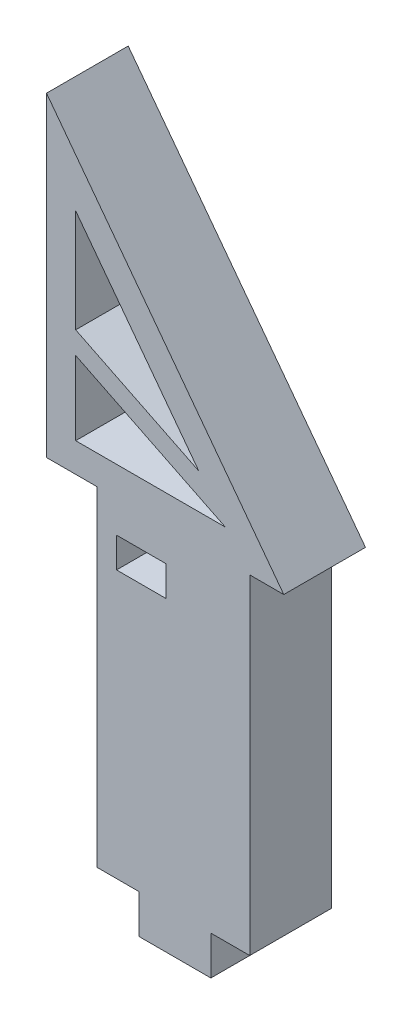
ISO-10303-21;
HEADER;
FILE_DESCRIPTION(('STEP AP214'),'2;1');
FILE_NAME('part.step','',(''),(''),'','','');
FILE_SCHEMA(('AUTOMOTIVE_DESIGN { 1 0 10303 214 1 1 1 1 }'));
ENDSEC;
DATA;
#1=APPLICATION_CONTEXT('core data for automotive mechanical design processes');
#2=APPLICATION_PROTOCOL_DEFINITION('international standard','automotive_design',2000,#1);
#3=PRODUCT_CONTEXT('',#1,'mechanical');
#4=PRODUCT('Part','Part','',(#3));
#5=PRODUCT_RELATED_PRODUCT_CATEGORY('part','',(#4));
#6=PRODUCT_DEFINITION_FORMATION('','',#4);
#7=PRODUCT_DEFINITION_CONTEXT('part definition',#1,'design');
#8=PRODUCT_DEFINITION('design','',#6,#7);
#9=PRODUCT_DEFINITION_SHAPE('','',#8);
#10=(LENGTH_UNIT() NAMED_UNIT(*) SI_UNIT(.MILLI.,.METRE.));
#11=(NAMED_UNIT(*) PLANE_ANGLE_UNIT() SI_UNIT($,.RADIAN.));
#12=(NAMED_UNIT(*) SI_UNIT($,.STERADIAN.) SOLID_ANGLE_UNIT());
#13=UNCERTAINTY_MEASURE_WITH_UNIT(LENGTH_MEASURE(1.E-05),#10,'distance_accuracy_value','');
#14=(GEOMETRIC_REPRESENTATION_CONTEXT(3) GLOBAL_UNCERTAINTY_ASSIGNED_CONTEXT((#13)) GLOBAL_UNIT_ASSIGNED_CONTEXT((#10,
#11,#12)) REPRESENTATION_CONTEXT('',''));
#15=CARTESIAN_POINT('',(0.,0.,0.));
#16=DIRECTION('',(0.,0.,1.));
#17=DIRECTION('',(1.,0.,0.));
#18=AXIS2_PLACEMENT_3D('',#15,#16,#17);
#19=CARTESIAN_POINT('',(-7.85,37.9,4.2));
#20=DIRECTION('',(1.,0.,0.));
#21=DIRECTION('',(0.,0.,-1.));
#22=AXIS2_PLACEMENT_3D('',#19,#20,#21);
#23=PLANE('',#22);
#24=DIRECTION('',(0.,-1.,0.));
#25=VECTOR('',#24,1.);
#26=CARTESIAN_POINT('',(-7.85,37.9,-4.2));
#27=LINE('',#26,#25);
#28=CARTESIAN_POINT('',(-7.85,37.9,-4.2));
#29=VERTEX_POINT('',#28);
#30=CARTESIAN_POINT('',(-7.85,4.,-4.2));
#31=VERTEX_POINT('',#30);
#32=EDGE_CURVE('E329',#29,#31,#27,.T.);
#33=ORIENTED_EDGE('',*,*,#32,.T.);
#34=DIRECTION('',(0.,0.,-1.));
#35=VECTOR('',#34,1.);
#36=CARTESIAN_POINT('',(-7.85,4.,4.2));
#37=LINE('',#36,#35);
#38=CARTESIAN_POINT('',(-7.85,4.,4.2));
#39=VERTEX_POINT('',#38);
#40=EDGE_CURVE('E218',#39,#31,#37,.T.);
#41=ORIENTED_EDGE('',*,*,#40,.F.);
#42=DIRECTION('',(0.,-1.,0.));
#43=VECTOR('',#42,1.);
#44=CARTESIAN_POINT('',(-7.85,37.9,4.2));
#45=LINE('',#44,#43);
#46=CARTESIAN_POINT('',(-7.85,37.9,4.2));
#47=VERTEX_POINT('',#46);
#48=EDGE_CURVE('E11',#47,#39,#45,.T.);
#49=ORIENTED_EDGE('',*,*,#48,.F.);
#50=DIRECTION('',(0.,0.,1.));
#51=VECTOR('',#50,1.);
#52=CARTESIAN_POINT('',(-7.85,37.9,4.2));
#53=LINE('',#52,#51);
#54=EDGE_CURVE('E322',#29,#47,#53,.T.);
#55=ORIENTED_EDGE('',*,*,#54,.F.);
#56=EDGE_LOOP('',(#33,#41,#49,#55));
#57=FACE_BOUND('',#56,.T.);
#58=ADVANCED_FACE('F32',(#57),#23,.F.);
#59=CARTESIAN_POINT('',(7.85,37.9,4.2));
#60=DIRECTION('',(0.,0.,-1.));
#61=DIRECTION('',(-1.,0.,0.));
#62=AXIS2_PLACEMENT_3D('',#59,#60,#61);
#63=PLANE('',#62);
#64=DIRECTION('',(-1.,0.,0.));
#65=VECTOR('',#64,1.);
#66=CARTESIAN_POINT('',(-0.749999999999998,31.49,4.2));
#67=LINE('',#66,#65);
#68=CARTESIAN_POINT('',(-0.749999999999998,31.49,4.2));
#69=VERTEX_POINT('',#68);
#70=CARTESIAN_POINT('',(-5.85,31.49,4.2));
#71=VERTEX_POINT('',#70);
#72=EDGE_CURVE('E182',#69,#71,#67,.T.);
#73=ORIENTED_EDGE('',*,*,#72,.T.);
#74=DIRECTION('',(0.,1.,0.));
#75=VECTOR('',#74,1.);
#76=CARTESIAN_POINT('',(-5.85,31.49,4.2));
#77=LINE('',#76,#75);
#78=CARTESIAN_POINT('',(-5.85,34.59,4.2));
#79=VERTEX_POINT('',#78);
#80=EDGE_CURVE('E176',#71,#79,#77,.T.);
#81=ORIENTED_EDGE('',*,*,#80,.T.);
#82=DIRECTION('',(1.,0.,0.));
#83=VECTOR('',#82,1.);
#84=CARTESIAN_POINT('',(-0.749999999999998,34.59,4.2));
#85=LINE('',#84,#83);
#86=CARTESIAN_POINT('',(-0.749999999999997,34.59,4.2));
#87=VERTEX_POINT('',#86);
#88=EDGE_CURVE('E185',#79,#87,#85,.T.);
#89=ORIENTED_EDGE('',*,*,#88,.T.);
#90=DIRECTION('',(0.,-1.,0.));
#91=VECTOR('',#90,1.);
#92=CARTESIAN_POINT('',(-0.749999999999998,31.49,4.2));
#93=LINE('',#92,#91);
#94=EDGE_CURVE('E46',#87,#69,#93,.T.);
#95=ORIENTED_EDGE('',*,*,#94,.T.);
#96=EDGE_LOOP('',(#73,#81,#89,#95));
#97=FACE_BOUND('',#96,.T.);
#98=DIRECTION('',(-1.,0.,0.));
#99=VECTOR('',#98,1.);
#100=CARTESIAN_POINT('',(5.34075216134061,40.9,4.2));
#101=LINE('',#100,#99);
#102=CARTESIAN_POINT('',(5.34075216134061,40.9,4.2));
#103=VERTEX_POINT('',#102);
#104=CARTESIAN_POINT('',(-10.05,40.9,4.2));
#105=VERTEX_POINT('',#104);
#106=EDGE_CURVE('E254',#103,#105,#101,.T.);
#107=ORIENTED_EDGE('',*,*,#106,.T.);
#108=DIRECTION('',(0.,1.,0.));
#109=VECTOR('',#108,1.);
#110=CARTESIAN_POINT('',(-10.05,40.9,4.2));
#111=LINE('',#110,#109);
#112=CARTESIAN_POINT('',(-10.05,48.4875437211514,4.2));
#113=VERTEX_POINT('',#112);
#114=EDGE_CURVE('E247',#105,#113,#111,.T.);
#115=ORIENTED_EDGE('',*,*,#114,.T.);
#116=DIRECTION('',(0.896926720508369,-0.44217921484179,0.));
#117=VECTOR('',#116,1.);
#118=CARTESIAN_POINT('',(-10.05,48.4875437211514,4.2));
#119=LINE('',#118,#117);
#120=EDGE_CURVE('E250',#113,#103,#119,.T.);
#121=ORIENTED_EDGE('',*,*,#120,.T.);
#122=EDGE_LOOP('',(#107,#115,#121));
#123=FACE_BOUND('',#122,.T.);
#124=DIRECTION('',(-0.896926720508369,0.44217921484179,0.));
#125=VECTOR('',#124,1.);
#126=CARTESIAN_POINT('',(2.61087112907547,44.5305180121723,4.2));
#127=LINE('',#126,#125);
#128=CARTESIAN_POINT('',(2.61087112907547,44.5305180121723,4.2));
#129=VERTEX_POINT('',#128);
#130=CARTESIAN_POINT('',(-10.05,50.772247606196,4.2));
#131=VERTEX_POINT('',#130);
#132=EDGE_CURVE('E278',#129,#131,#127,.T.);
#133=ORIENTED_EDGE('',*,*,#132,.T.);
#134=DIRECTION('',(0.,1.,0.));
#135=VECTOR('',#134,1.);
#136=CARTESIAN_POINT('',(-10.05,50.772247606196,4.2));
#137=LINE('',#136,#135);
#138=CARTESIAN_POINT('',(-10.05,61.3684388375206,4.2));
#139=VERTEX_POINT('',#138);
#140=EDGE_CURVE('E271',#131,#139,#137,.T.);
#141=ORIENTED_EDGE('',*,*,#140,.T.);
#142=DIRECTION('',(0.600984765930578,-0.799260477641281,0.));
#143=VECTOR('',#142,1.);
#144=CARTESIAN_POINT('',(-10.05,61.3684388375206,4.2));
#145=LINE('',#144,#143);
#146=EDGE_CURVE('E274',#139,#129,#145,.T.);
#147=ORIENTED_EDGE('',*,*,#146,.T.);
#148=EDGE_LOOP('',(#133,#141,#147));
#149=FACE_BOUND('',#148,.T.);
#150=DIRECTION('',(1.,0.,0.));
#151=VECTOR('',#150,1.);
#152=CARTESIAN_POINT('',(-3.55,4.,4.2));
#153=LINE('',#152,#151);
#154=CARTESIAN_POINT('',(-3.55,4.,4.2));
#155=VERTEX_POINT('',#154);
#156=EDGE_CURVE('E211',#39,#155,#153,.T.);
#157=ORIENTED_EDGE('',*,*,#156,.T.);
#158=DIRECTION('',(0.,-1.,0.));
#159=VECTOR('',#158,1.);
#160=CARTESIAN_POINT('',(-3.55,4.,4.2));
#161=LINE('',#160,#159);
#162=CARTESIAN_POINT('',(-3.55,0.,4.2));
#163=VERTEX_POINT('',#162);
#164=EDGE_CURVE('E214',#155,#163,#161,.T.);
#165=ORIENTED_EDGE('',*,*,#164,.T.);
#166=DIRECTION('',(1.,0.,0.));
#167=VECTOR('',#166,1.);
#168=CARTESIAN_POINT('',(7.85,0.,4.2));
#169=LINE('',#168,#167);
#170=CARTESIAN_POINT('',(3.85,0.,4.2));
#171=VERTEX_POINT('',#170);
#172=EDGE_CURVE('E317',#163,#171,#169,.T.);
#173=ORIENTED_EDGE('',*,*,#172,.T.);
#174=DIRECTION('',(0.,1.,0.));
#175=VECTOR('',#174,1.);
#176=CARTESIAN_POINT('',(3.85,4.,4.2));
#177=LINE('',#176,#175);
#178=CARTESIAN_POINT('',(3.85,4.,4.2));
#179=VERTEX_POINT('',#178);
#180=EDGE_CURVE('E231',#171,#179,#177,.T.);
#181=ORIENTED_EDGE('',*,*,#180,.T.);
#182=DIRECTION('',(1.,0.,0.));
#183=VECTOR('',#182,1.);
#184=CARTESIAN_POINT('',(3.85,4.,4.2));
#185=LINE('',#184,#183);
#186=CARTESIAN_POINT('',(7.85,4.,4.2));
#187=VERTEX_POINT('',#186);
#188=EDGE_CURVE('E234',#179,#187,#185,.T.);
#189=ORIENTED_EDGE('',*,*,#188,.T.);
#190=DIRECTION('',(0.,-1.,0.));
#191=VECTOR('',#190,1.);
#192=CARTESIAN_POINT('',(7.85,37.9,4.2));
#193=LINE('',#192,#191);
#194=CARTESIAN_POINT('',(7.85,37.9,4.2));
#195=VERTEX_POINT('',#194);
#196=EDGE_CURVE('E39',#195,#187,#193,.T.);
#197=ORIENTED_EDGE('',*,*,#196,.F.);
#198=DIRECTION('',(1.,0.,0.));
#199=VECTOR('',#198,1.);
#200=CARTESIAN_POINT('',(-13.05,37.9,4.2));
#201=LINE('',#200,#199);
#202=CARTESIAN_POINT('',(11.35,37.9,4.2));
#203=VERTEX_POINT('',#202);
#204=EDGE_CURVE('E309',#195,#203,#201,.T.);
#205=ORIENTED_EDGE('',*,*,#204,.T.);
#206=DIRECTION('',(-0.600984765930578,0.799260477641281,0.));
#207=VECTOR('',#206,1.);
#208=CARTESIAN_POINT('',(11.35,37.9,4.2));
#209=LINE('',#208,#207);
#210=CARTESIAN_POINT('',(-13.05,70.35,4.2));
#211=VERTEX_POINT('',#210);
#212=EDGE_CURVE('E299',#203,#211,#209,.T.);
#213=ORIENTED_EDGE('',*,*,#212,.T.);
#214=DIRECTION('',(0.,-1.,0.));
#215=VECTOR('',#214,1.);
#216=CARTESIAN_POINT('',(-13.05,70.35,4.2));
#217=LINE('',#216,#215);
#218=CARTESIAN_POINT('',(-13.05,37.9,4.2));
#219=VERTEX_POINT('',#218);
#220=EDGE_CURVE('E290',#211,#219,#217,.T.);
#221=ORIENTED_EDGE('',*,*,#220,.T.);
#222=EDGE_CURVE('E310',#219,#47,#201,.T.);
#223=ORIENTED_EDGE('',*,*,#222,.T.);
#224=ORIENTED_EDGE('',*,*,#48,.T.);
#225=EDGE_LOOP('',(#157,#165,#173,#181,#189,#197,#205,#213,#221,#223,#224));
#226=FACE_BOUND('',#225,.T.);
#227=ADVANCED_FACE('F189',(#97,#123,#149,#226),#63,.F.);
#228=CARTESIAN_POINT('',(7.85,37.9,4.2));
#229=DIRECTION('',(-1.,0.,0.));
#230=DIRECTION('',(0.,0.,1.));
#231=AXIS2_PLACEMENT_3D('',#228,#229,#230);
#232=PLANE('',#231);
#233=ORIENTED_EDGE('',*,*,#196,.T.);
#234=DIRECTION('',(0.,0.,-1.));
#235=VECTOR('',#234,1.);
#236=CARTESIAN_POINT('',(7.85,4.,4.2));
#237=LINE('',#236,#235);
#238=CARTESIAN_POINT('',(7.85,4.,-4.2));
#239=VERTEX_POINT('',#238);
#240=EDGE_CURVE('E222',#187,#239,#237,.T.);
#241=ORIENTED_EDGE('',*,*,#240,.T.);
#242=DIRECTION('',(0.,-1.,0.));
#243=VECTOR('',#242,1.);
#244=CARTESIAN_POINT('',(7.85,37.9,-4.2));
#245=LINE('',#244,#243);
#246=CARTESIAN_POINT('',(7.85,37.9,-4.2));
#247=VERTEX_POINT('',#246);
#248=EDGE_CURVE('E336',#247,#239,#245,.T.);
#249=ORIENTED_EDGE('',*,*,#248,.F.);
#250=DIRECTION('',(0.,0.,-1.));
#251=VECTOR('',#250,1.);
#252=CARTESIAN_POINT('',(7.85,37.9,4.2));
#253=LINE('',#252,#251);
#254=EDGE_CURVE('E325',#195,#247,#253,.T.);
#255=ORIENTED_EDGE('',*,*,#254,.F.);
#256=EDGE_LOOP('',(#233,#241,#249,#255));
#257=FACE_BOUND('',#256,.T.);
#258=ADVANCED_FACE('F341',(#257),#232,.F.);
#259=CARTESIAN_POINT('',(7.85,37.9,-4.2));
#260=DIRECTION('',(0.,0.,1.));
#261=DIRECTION('',(1.,0.,0.));
#262=AXIS2_PLACEMENT_3D('',#259,#260,#261);
#263=PLANE('',#262);
#264=DIRECTION('',(1.,0.,0.));
#265=VECTOR('',#264,1.);
#266=CARTESIAN_POINT('',(-0.749999999999998,34.59,-4.2));
#267=LINE('',#266,#265);
#268=CARTESIAN_POINT('',(-5.85,34.59,-4.2));
#269=VERTEX_POINT('',#268);
#270=CARTESIAN_POINT('',(-0.749999999999998,34.59,-4.2));
#271=VERTEX_POINT('',#270);
#272=EDGE_CURVE('E201',#269,#271,#267,.T.);
#273=ORIENTED_EDGE('',*,*,#272,.F.);
#274=DIRECTION('',(0.,1.,0.));
#275=VECTOR('',#274,1.);
#276=CARTESIAN_POINT('',(-5.85,31.49,-4.2));
#277=LINE('',#276,#275);
#278=CARTESIAN_POINT('',(-5.85,31.49,-4.2));
#279=VERTEX_POINT('',#278);
#280=EDGE_CURVE('E54',#279,#269,#277,.T.);
#281=ORIENTED_EDGE('',*,*,#280,.F.);
#282=DIRECTION('',(-1.,0.,0.));
#283=VECTOR('',#282,1.);
#284=CARTESIAN_POINT('',(-0.749999999999998,31.49,-4.2));
#285=LINE('',#284,#283);
#286=CARTESIAN_POINT('',(-0.749999999999998,31.49,-4.2));
#287=VERTEX_POINT('',#286);
#288=EDGE_CURVE('E192',#287,#279,#285,.T.);
#289=ORIENTED_EDGE('',*,*,#288,.F.);
#290=DIRECTION('',(0.,-1.,0.));
#291=VECTOR('',#290,1.);
#292=CARTESIAN_POINT('',(-0.749999999999998,31.49,-4.2));
#293=LINE('',#292,#291);
#294=EDGE_CURVE('E195',#271,#287,#293,.T.);
#295=ORIENTED_EDGE('',*,*,#294,.F.);
#296=EDGE_LOOP('',(#273,#281,#289,#295));
#297=FACE_BOUND('',#296,.T.);
#298=DIRECTION('',(0.896926720508369,-0.44217921484179,0.));
#299=VECTOR('',#298,1.);
#300=CARTESIAN_POINT('',(-10.05,48.4875437211514,-4.2));
#301=LINE('',#300,#299);
#302=CARTESIAN_POINT('',(-10.05,48.4875437211514,-4.2));
#303=VERTEX_POINT('',#302);
#304=CARTESIAN_POINT('',(5.34075216134061,40.9,-4.2));
#305=VERTEX_POINT('',#304);
#306=EDGE_CURVE('E259',#303,#305,#301,.T.);
#307=ORIENTED_EDGE('',*,*,#306,.F.);
#308=DIRECTION('',(0.,1.,0.));
#309=VECTOR('',#308,1.);
#310=CARTESIAN_POINT('',(-10.05,40.9,-4.2));
#311=LINE('',#310,#309);
#312=CARTESIAN_POINT('',(-10.05,40.9,-4.2));
#313=VERTEX_POINT('',#312);
#314=EDGE_CURVE('E227',#313,#303,#311,.T.);
#315=ORIENTED_EDGE('',*,*,#314,.F.);
#316=DIRECTION('',(-1.,0.,0.));
#317=VECTOR('',#316,1.);
#318=CARTESIAN_POINT('',(5.34075216134061,40.9,-4.2));
#319=LINE('',#318,#317);
#320=EDGE_CURVE('E251',#305,#313,#319,.T.);
#321=ORIENTED_EDGE('',*,*,#320,.F.);
#322=EDGE_LOOP('',(#307,#315,#321));
#323=FACE_BOUND('',#322,.T.);
#324=DIRECTION('',(0.600984765930578,-0.799260477641281,0.));
#325=VECTOR('',#324,1.);
#326=CARTESIAN_POINT('',(-10.05,61.3684388375206,-4.2));
#327=LINE('',#326,#325);
#328=CARTESIAN_POINT('',(-10.05,61.3684388375206,-4.2));
#329=VERTEX_POINT('',#328);
#330=CARTESIAN_POINT('',(2.61087112907547,44.5305180121723,-4.2));
#331=VERTEX_POINT('',#330);
#332=EDGE_CURVE('E283',#329,#331,#327,.T.);
#333=ORIENTED_EDGE('',*,*,#332,.F.);
#334=DIRECTION('',(0.,1.,0.));
#335=VECTOR('',#334,1.);
#336=CARTESIAN_POINT('',(-10.05,50.772247606196,-4.2));
#337=LINE('',#336,#335);
#338=CARTESIAN_POINT('',(-10.05,50.772247606196,-4.2));
#339=VERTEX_POINT('',#338);
#340=EDGE_CURVE('E266',#339,#329,#337,.T.);
#341=ORIENTED_EDGE('',*,*,#340,.F.);
#342=DIRECTION('',(-0.896926720508369,0.44217921484179,0.));
#343=VECTOR('',#342,1.);
#344=CARTESIAN_POINT('',(2.61087112907547,44.5305180121723,-4.2));
#345=LINE('',#344,#343);
#346=EDGE_CURVE('E275',#331,#339,#345,.T.);
#347=ORIENTED_EDGE('',*,*,#346,.F.);
#348=EDGE_LOOP('',(#333,#341,#347));
#349=FACE_BOUND('',#348,.T.);
#350=DIRECTION('',(-1.,0.,0.));
#351=VECTOR('',#350,1.);
#352=CARTESIAN_POINT('',(7.85,0.,-4.2));
#353=LINE('',#352,#351);
#354=CARTESIAN_POINT('',(3.85,0.,-4.2));
#355=VERTEX_POINT('',#354);
#356=CARTESIAN_POINT('',(-3.55,0.,-4.2));
#357=VERTEX_POINT('',#356);
#358=EDGE_CURVE('E326',#355,#357,#353,.T.);
#359=ORIENTED_EDGE('',*,*,#358,.T.);
#360=DIRECTION('',(0.,-1.,0.));
#361=VECTOR('',#360,1.);
#362=CARTESIAN_POINT('',(-3.55,4.,-4.2));
#363=LINE('',#362,#361);
#364=CARTESIAN_POINT('',(-3.55,4.,-4.2));
#365=VERTEX_POINT('',#364);
#366=EDGE_CURVE('E215',#365,#357,#363,.T.);
#367=ORIENTED_EDGE('',*,*,#366,.F.);
#368=DIRECTION('',(1.,0.,0.));
#369=VECTOR('',#368,1.);
#370=CARTESIAN_POINT('',(-3.55,4.,-4.2));
#371=LINE('',#370,#369);
#372=EDGE_CURVE('E219',#31,#365,#371,.T.);
#373=ORIENTED_EDGE('',*,*,#372,.F.);
#374=ORIENTED_EDGE('',*,*,#32,.F.);
#375=DIRECTION('',(1.,0.,0.));
#376=VECTOR('',#375,1.);
#377=CARTESIAN_POINT('',(-13.05,37.9,-4.2));
#378=LINE('',#377,#376);
#379=CARTESIAN_POINT('',(-13.05,37.9,-4.2));
#380=VERTEX_POINT('',#379);
#381=EDGE_CURVE('E300',#380,#29,#378,.T.);
#382=ORIENTED_EDGE('',*,*,#381,.F.);
#383=DIRECTION('',(0.,-1.,0.));
#384=VECTOR('',#383,1.);
#385=CARTESIAN_POINT('',(-13.05,70.35,-4.2));
#386=LINE('',#385,#384);
#387=CARTESIAN_POINT('',(-13.05,70.35,-4.2));
#388=VERTEX_POINT('',#387);
#389=EDGE_CURVE('E295',#388,#380,#386,.T.);
#390=ORIENTED_EDGE('',*,*,#389,.F.);
#391=DIRECTION('',(-0.600984765930578,0.799260477641281,0.));
#392=VECTOR('',#391,1.);
#393=CARTESIAN_POINT('',(11.35,37.9,-4.2));
#394=LINE('',#393,#392);
#395=CARTESIAN_POINT('',(11.35,37.9,-4.2));
#396=VERTEX_POINT('',#395);
#397=EDGE_CURVE('E303',#396,#388,#394,.T.);
#398=ORIENTED_EDGE('',*,*,#397,.F.);
#399=EDGE_CURVE('E298',#247,#396,#378,.T.);
#400=ORIENTED_EDGE('',*,*,#399,.F.);
#401=ORIENTED_EDGE('',*,*,#248,.T.);
#402=DIRECTION('',(1.,0.,0.));
#403=VECTOR('',#402,1.);
#404=CARTESIAN_POINT('',(3.85,4.,-4.2));
#405=LINE('',#404,#403);
#406=CARTESIAN_POINT('',(3.85,4.,-4.2));
#407=VERTEX_POINT('',#406);
#408=EDGE_CURVE('E235',#407,#239,#405,.T.);
#409=ORIENTED_EDGE('',*,*,#408,.F.);
#410=DIRECTION('',(0.,1.,0.));
#411=VECTOR('',#410,1.);
#412=CARTESIAN_POINT('',(3.85,4.,-4.2));
#413=LINE('',#412,#411);
#414=EDGE_CURVE('E207',#355,#407,#413,.T.);
#415=ORIENTED_EDGE('',*,*,#414,.F.);
#416=EDGE_LOOP('',(#359,#367,#373,#374,#382,#390,#398,#400,#401,#409,#415));
#417=FACE_BOUND('',#416,.T.);
#418=ADVANCED_FACE('F350',(#297,#323,#349,#417),#263,.F.);
#419=CARTESIAN_POINT('',(0.,0.,0.));
#420=DIRECTION('',(0.,1.,0.));
#421=DIRECTION('',(0.,0.,1.));
#422=AXIS2_PLACEMENT_3D('',#419,#420,#421);
#423=PLANE('',#422);
#424=ORIENTED_EDGE('',*,*,#172,.F.);
#425=DIRECTION('',(0.,0.,-1.));
#426=VECTOR('',#425,1.);
#427=CARTESIAN_POINT('',(-3.55,0.,4.2));
#428=LINE('',#427,#426);
#429=EDGE_CURVE('E224',#163,#357,#428,.T.);
#430=ORIENTED_EDGE('',*,*,#429,.T.);
#431=ORIENTED_EDGE('',*,*,#358,.F.);
#432=DIRECTION('',(0.,0.,-1.));
#433=VECTOR('',#432,1.);
#434=CARTESIAN_POINT('',(3.85,0.,4.2));
#435=LINE('',#434,#433);
#436=EDGE_CURVE('E238',#171,#355,#435,.T.);
#437=ORIENTED_EDGE('',*,*,#436,.F.);
#438=EDGE_LOOP('',(#424,#430,#431,#437));
#439=FACE_BOUND('',#438,.T.);
#440=ADVANCED_FACE('F380',(#439),#423,.F.);
#441=CARTESIAN_POINT('',(-13.05,37.9,-4.2));
#442=DIRECTION('',(0.,-1.,0.));
#443=DIRECTION('',(0.,0.,-1.));
#444=AXIS2_PLACEMENT_3D('',#441,#442,#443);
#445=PLANE('',#444);
#446=ORIENTED_EDGE('',*,*,#381,.T.);
#447=ORIENTED_EDGE('',*,*,#54,.T.);
#448=ORIENTED_EDGE('',*,*,#222,.F.);
#449=DIRECTION('',(0.,0.,1.));
#450=VECTOR('',#449,1.);
#451=CARTESIAN_POINT('',(-13.05,37.9,-4.2));
#452=LINE('',#451,#450);
#453=EDGE_CURVE('E306',#380,#219,#452,.T.);
#454=ORIENTED_EDGE('',*,*,#453,.F.);
#455=EDGE_LOOP('',(#446,#447,#448,#454));
#456=FACE_BOUND('',#455,.T.);
#457=ADVANCED_FACE('F367',(#456),#445,.T.);
#458=CARTESIAN_POINT('',(-13.05,70.35,-4.2));
#459=DIRECTION('',(-1.,0.,0.));
#460=DIRECTION('',(0.,-1.,0.));
#461=AXIS2_PLACEMENT_3D('',#458,#459,#460);
#462=PLANE('',#461);
#463=ORIENTED_EDGE('',*,*,#220,.F.);
#464=DIRECTION('',(0.,0.,1.));
#465=VECTOR('',#464,1.);
#466=CARTESIAN_POINT('',(-13.05,70.35,-4.2));
#467=LINE('',#466,#465);
#468=EDGE_CURVE('E315',#388,#211,#467,.T.);
#469=ORIENTED_EDGE('',*,*,#468,.F.);
#470=ORIENTED_EDGE('',*,*,#389,.T.);
#471=ORIENTED_EDGE('',*,*,#453,.T.);
#472=EDGE_LOOP('',(#463,#469,#470,#471));
#473=FACE_BOUND('',#472,.T.);
#474=ADVANCED_FACE('F363',(#473),#462,.T.);
#475=CARTESIAN_POINT('',(11.35,37.9,-4.2));
#476=DIRECTION('',(0.799260477641281,0.600984765930578,0.));
#477=DIRECTION('',(-0.600984765930578,0.799260477641281,0.));
#478=AXIS2_PLACEMENT_3D('',#475,#476,#477);
#479=PLANE('',#478);
#480=ORIENTED_EDGE('',*,*,#212,.F.);
#481=DIRECTION('',(0.,0.,1.));
#482=VECTOR('',#481,1.);
#483=CARTESIAN_POINT('',(11.35,37.9,-4.2));
#484=LINE('',#483,#482);
#485=EDGE_CURVE('E318',#396,#203,#484,.T.);
#486=ORIENTED_EDGE('',*,*,#485,.F.);
#487=ORIENTED_EDGE('',*,*,#397,.T.);
#488=ORIENTED_EDGE('',*,*,#468,.T.);
#489=EDGE_LOOP('',(#480,#486,#487,#488));
#490=FACE_BOUND('',#489,.T.);
#491=ADVANCED_FACE('F359',(#490),#479,.T.);
#492=ORIENTED_EDGE('',*,*,#204,.F.);
#493=ORIENTED_EDGE('',*,*,#254,.T.);
#494=ORIENTED_EDGE('',*,*,#399,.T.);
#495=ORIENTED_EDGE('',*,*,#485,.T.);
#496=EDGE_LOOP('',(#492,#493,#494,#495));
#497=FACE_BOUND('',#496,.T.);
#498=ADVANCED_FACE('F355',(#497),#445,.T.);
#499=CARTESIAN_POINT('',(-10.05,50.772247606196,4.2));
#500=DIRECTION('',(-1.,0.,0.));
#501=DIRECTION('',(0.,0.,1.));
#502=AXIS2_PLACEMENT_3D('',#499,#500,#501);
#503=PLANE('',#502);
#504=ORIENTED_EDGE('',*,*,#340,.T.);
#505=DIRECTION('',(0.,0.,-1.));
#506=VECTOR('',#505,1.);
#507=CARTESIAN_POINT('',(-10.05,61.3684388375206,4.2));
#508=LINE('',#507,#506);
#509=EDGE_CURVE('E281',#139,#329,#508,.T.);
#510=ORIENTED_EDGE('',*,*,#509,.F.);
#511=ORIENTED_EDGE('',*,*,#140,.F.);
#512=DIRECTION('',(0.,0.,-1.));
#513=VECTOR('',#512,1.);
#514=CARTESIAN_POINT('',(-10.05,50.772247606196,4.2));
#515=LINE('',#514,#513);
#516=EDGE_CURVE('E288',#131,#339,#515,.T.);
#517=ORIENTED_EDGE('',*,*,#516,.T.);
#518=EDGE_LOOP('',(#504,#510,#511,#517));
#519=FACE_BOUND('',#518,.T.);
#520=ADVANCED_FACE('F414',(#519),#503,.F.);
#521=CARTESIAN_POINT('',(2.61087112907547,44.5305180121723,4.2));
#522=DIRECTION('',(-0.44217921484179,-0.896926720508369,0.));
#523=DIRECTION('',(0.896926720508369,-0.44217921484179,0.));
#524=AXIS2_PLACEMENT_3D('',#521,#522,#523);
#525=PLANE('',#524);
#526=ORIENTED_EDGE('',*,*,#346,.T.);
#527=ORIENTED_EDGE('',*,*,#516,.F.);
#528=ORIENTED_EDGE('',*,*,#132,.F.);
#529=DIRECTION('',(0.,0.,-1.));
#530=VECTOR('',#529,1.);
#531=CARTESIAN_POINT('',(2.61087112907547,44.5305180121723,4.2));
#532=LINE('',#531,#530);
#533=EDGE_CURVE('E291',#129,#331,#532,.T.);
#534=ORIENTED_EDGE('',*,*,#533,.T.);
#535=EDGE_LOOP('',(#526,#527,#528,#534));
#536=FACE_BOUND('',#535,.T.);
#537=ADVANCED_FACE('F419',(#536),#525,.F.);
#538=CARTESIAN_POINT('',(-10.05,61.3684388375206,4.2));
#539=DIRECTION('',(0.799260477641281,0.600984765930578,0.));
#540=DIRECTION('',(-0.600984765930578,0.799260477641281,0.));
#541=AXIS2_PLACEMENT_3D('',#538,#539,#540);
#542=PLANE('',#541);
#543=ORIENTED_EDGE('',*,*,#332,.T.);
#544=ORIENTED_EDGE('',*,*,#533,.F.);
#545=ORIENTED_EDGE('',*,*,#146,.F.);
#546=ORIENTED_EDGE('',*,*,#509,.T.);
#547=EDGE_LOOP('',(#543,#544,#545,#546));
#548=FACE_BOUND('',#547,.T.);
#549=ADVANCED_FACE('F421',(#548),#542,.F.);
#550=CARTESIAN_POINT('',(-10.05,40.9,4.2));
#551=DIRECTION('',(-1.,0.,0.));
#552=DIRECTION('',(0.,0.,1.));
#553=AXIS2_PLACEMENT_3D('',#550,#551,#552);
#554=PLANE('',#553);
#555=ORIENTED_EDGE('',*,*,#314,.T.);
#556=DIRECTION('',(0.,0.,-1.));
#557=VECTOR('',#556,1.);
#558=CARTESIAN_POINT('',(-10.05,48.4875437211514,4.2));
#559=LINE('',#558,#557);
#560=EDGE_CURVE('E257',#113,#303,#559,.T.);
#561=ORIENTED_EDGE('',*,*,#560,.F.);
#562=ORIENTED_EDGE('',*,*,#114,.F.);
#563=DIRECTION('',(0.,0.,-1.));
#564=VECTOR('',#563,1.);
#565=CARTESIAN_POINT('',(-10.05,40.9,4.2));
#566=LINE('',#565,#564);
#567=EDGE_CURVE('E264',#105,#313,#566,.T.);
#568=ORIENTED_EDGE('',*,*,#567,.T.);
#569=EDGE_LOOP('',(#555,#561,#562,#568));
#570=FACE_BOUND('',#569,.T.);
#571=ADVANCED_FACE('F424',(#570),#554,.F.);
#572=CARTESIAN_POINT('',(5.34075216134061,40.9,4.2));
#573=DIRECTION('',(0.,-1.,0.));
#574=DIRECTION('',(0.,0.,-1.));
#575=AXIS2_PLACEMENT_3D('',#572,#573,#574);
#576=PLANE('',#575);
#577=ORIENTED_EDGE('',*,*,#320,.T.);
#578=ORIENTED_EDGE('',*,*,#567,.F.);
#579=ORIENTED_EDGE('',*,*,#106,.F.);
#580=DIRECTION('',(0.,0.,-1.));
#581=VECTOR('',#580,1.);
#582=CARTESIAN_POINT('',(5.34075216134061,40.9,4.2));
#583=LINE('',#582,#581);
#584=EDGE_CURVE('E267',#103,#305,#583,.T.);
#585=ORIENTED_EDGE('',*,*,#584,.T.);
#586=EDGE_LOOP('',(#577,#578,#579,#585));
#587=FACE_BOUND('',#586,.T.);
#588=ADVANCED_FACE('F431',(#587),#576,.F.);
#589=CARTESIAN_POINT('',(-10.05,48.4875437211514,4.2));
#590=DIRECTION('',(0.44217921484179,0.896926720508369,0.));
#591=DIRECTION('',(-0.896926720508369,0.44217921484179,0.));
#592=AXIS2_PLACEMENT_3D('',#589,#590,#591);
#593=PLANE('',#592);
#594=ORIENTED_EDGE('',*,*,#306,.T.);
#595=ORIENTED_EDGE('',*,*,#584,.F.);
#596=ORIENTED_EDGE('',*,*,#120,.F.);
#597=ORIENTED_EDGE('',*,*,#560,.T.);
#598=EDGE_LOOP('',(#594,#595,#596,#597));
#599=FACE_BOUND('',#598,.T.);
#600=ADVANCED_FACE('F391',(#599),#593,.F.);
#601=CARTESIAN_POINT('',(3.85,4.,4.2));
#602=DIRECTION('',(0.,1.,0.));
#603=DIRECTION('',(0.,0.,1.));
#604=AXIS2_PLACEMENT_3D('',#601,#602,#603);
#605=PLANE('',#604);
#606=ORIENTED_EDGE('',*,*,#408,.T.);
#607=ORIENTED_EDGE('',*,*,#240,.F.);
#608=ORIENTED_EDGE('',*,*,#188,.F.);
#609=DIRECTION('',(0.,0.,-1.));
#610=VECTOR('',#609,1.);
#611=CARTESIAN_POINT('',(3.85,4.,4.2));
#612=LINE('',#611,#610);
#613=EDGE_CURVE('E244',#179,#407,#612,.T.);
#614=ORIENTED_EDGE('',*,*,#613,.T.);
#615=EDGE_LOOP('',(#606,#607,#608,#614));
#616=FACE_BOUND('',#615,.T.);
#617=ADVANCED_FACE('F346',(#616),#605,.F.);
#618=CARTESIAN_POINT('',(3.85,4.,4.2));
#619=DIRECTION('',(-1.,0.,0.));
#620=DIRECTION('',(0.,0.,1.));
#621=AXIS2_PLACEMENT_3D('',#618,#619,#620);
#622=PLANE('',#621);
#623=ORIENTED_EDGE('',*,*,#414,.T.);
#624=ORIENTED_EDGE('',*,*,#613,.F.);
#625=ORIENTED_EDGE('',*,*,#180,.F.);
#626=ORIENTED_EDGE('',*,*,#436,.T.);
#627=EDGE_LOOP('',(#623,#624,#625,#626));
#628=FACE_BOUND('',#627,.T.);
#629=ADVANCED_FACE('F383',(#628),#622,.F.);
#630=CARTESIAN_POINT('',(-3.55,4.,4.2));
#631=DIRECTION('',(1.,0.,0.));
#632=DIRECTION('',(0.,0.,-1.));
#633=AXIS2_PLACEMENT_3D('',#630,#631,#632);
#634=PLANE('',#633);
#635=ORIENTED_EDGE('',*,*,#366,.T.);
#636=ORIENTED_EDGE('',*,*,#429,.F.);
#637=ORIENTED_EDGE('',*,*,#164,.F.);
#638=DIRECTION('',(0.,0.,-1.));
#639=VECTOR('',#638,1.);
#640=CARTESIAN_POINT('',(-3.55,4.,4.2));
#641=LINE('',#640,#639);
#642=EDGE_CURVE('E228',#155,#365,#641,.T.);
#643=ORIENTED_EDGE('',*,*,#642,.T.);
#644=EDGE_LOOP('',(#635,#636,#637,#643));
#645=FACE_BOUND('',#644,.T.);
#646=ADVANCED_FACE('F378',(#645),#634,.F.);
#647=CARTESIAN_POINT('',(-3.55,4.,4.2));
#648=DIRECTION('',(0.,1.,0.));
#649=DIRECTION('',(0.,0.,1.));
#650=AXIS2_PLACEMENT_3D('',#647,#648,#649);
#651=PLANE('',#650);
#652=ORIENTED_EDGE('',*,*,#372,.T.);
#653=ORIENTED_EDGE('',*,*,#642,.F.);
#654=ORIENTED_EDGE('',*,*,#156,.F.);
#655=ORIENTED_EDGE('',*,*,#40,.T.);
#656=EDGE_LOOP('',(#652,#653,#654,#655));
#657=FACE_BOUND('',#656,.T.);
#658=ADVANCED_FACE('F374',(#657),#651,.F.);
#659=CARTESIAN_POINT('',(-5.85,31.49,4.2));
#660=DIRECTION('',(-1.,0.,0.));
#661=DIRECTION('',(0.,0.,1.));
#662=AXIS2_PLACEMENT_3D('',#659,#660,#661);
#663=PLANE('',#662);
#664=ORIENTED_EDGE('',*,*,#280,.T.);
#665=DIRECTION('',(0.,0.,-1.));
#666=VECTOR('',#665,1.);
#667=CARTESIAN_POINT('',(-5.85,34.59,4.2));
#668=LINE('',#667,#666);
#669=EDGE_CURVE('E172',#79,#269,#668,.T.);
#670=ORIENTED_EDGE('',*,*,#669,.F.);
#671=ORIENTED_EDGE('',*,*,#80,.F.);
#672=DIRECTION('',(0.,0.,-1.));
#673=VECTOR('',#672,1.);
#674=CARTESIAN_POINT('',(-5.85,31.49,4.2));
#675=LINE('',#674,#673);
#676=EDGE_CURVE('E205',#71,#279,#675,.T.);
#677=ORIENTED_EDGE('',*,*,#676,.T.);
#678=EDGE_LOOP('',(#664,#670,#671,#677));
#679=FACE_BOUND('',#678,.T.);
#680=ADVANCED_FACE('F174',(#679),#663,.F.);
#681=CARTESIAN_POINT('',(-0.749999999999998,31.49,4.2));
#682=DIRECTION('',(0.,-1.,0.));
#683=DIRECTION('',(0.,0.,-1.));
#684=AXIS2_PLACEMENT_3D('',#681,#682,#683);
#685=PLANE('',#684);
#686=ORIENTED_EDGE('',*,*,#288,.T.);
#687=ORIENTED_EDGE('',*,*,#676,.F.);
#688=ORIENTED_EDGE('',*,*,#72,.F.);
#689=DIRECTION('',(0.,0.,-1.));
#690=VECTOR('',#689,1.);
#691=CARTESIAN_POINT('',(-0.749999999999998,31.49,4.2));
#692=LINE('',#691,#690);
#693=EDGE_CURVE('E208',#69,#287,#692,.T.);
#694=ORIENTED_EDGE('',*,*,#693,.T.);
#695=EDGE_LOOP('',(#686,#687,#688,#694));
#696=FACE_BOUND('',#695,.T.);
#697=ADVANCED_FACE('F491',(#696),#685,.F.);
#698=CARTESIAN_POINT('',(-0.749999999999998,31.49,4.2));
#699=DIRECTION('',(1.,0.,0.));
#700=DIRECTION('',(0.,0.,-1.));
#701=AXIS2_PLACEMENT_3D('',#698,#699,#700);
#702=PLANE('',#701);
#703=ORIENTED_EDGE('',*,*,#294,.T.);
#704=ORIENTED_EDGE('',*,*,#693,.F.);
#705=ORIENTED_EDGE('',*,*,#94,.F.);
#706=DIRECTION('',(0.,0.,-1.));
#707=VECTOR('',#706,1.);
#708=CARTESIAN_POINT('',(-0.749999999999998,34.59,4.2));
#709=LINE('',#708,#707);
#710=EDGE_CURVE('E181',#87,#271,#709,.T.);
#711=ORIENTED_EDGE('',*,*,#710,.T.);
#712=EDGE_LOOP('',(#703,#704,#705,#711));
#713=FACE_BOUND('',#712,.T.);
#714=ADVANCED_FACE('F497',(#713),#702,.F.);
#715=CARTESIAN_POINT('',(-0.749999999999998,34.59,4.2));
#716=DIRECTION('',(0.,1.,0.));
#717=DIRECTION('',(0.,0.,1.));
#718=AXIS2_PLACEMENT_3D('',#715,#716,#717);
#719=PLANE('',#718);
#720=ORIENTED_EDGE('',*,*,#272,.T.);
#721=ORIENTED_EDGE('',*,*,#710,.F.);
#722=ORIENTED_EDGE('',*,*,#88,.F.);
#723=ORIENTED_EDGE('',*,*,#669,.T.);
#724=EDGE_LOOP('',(#720,#721,#722,#723));
#725=FACE_BOUND('',#724,.T.);
#726=ADVANCED_FACE('F186',(#725),#719,.F.);
#727=CLOSED_SHELL('',(#58,#227,#258,#418,#440,#457,#474,#491,#498,#520,#537,#549,#571,#588,#600,
#617,#629,#646,#658,#680,#697,#714,#726));
#728=MANIFOLD_SOLID_BREP('B2',#727);
#729=ADVANCED_BREP_SHAPE_REPRESENTATION('',(#18,#728),#14);
#730=SHAPE_DEFINITION_REPRESENTATION(#9,#729);
ENDSEC;
END-ISO-10303-21;
